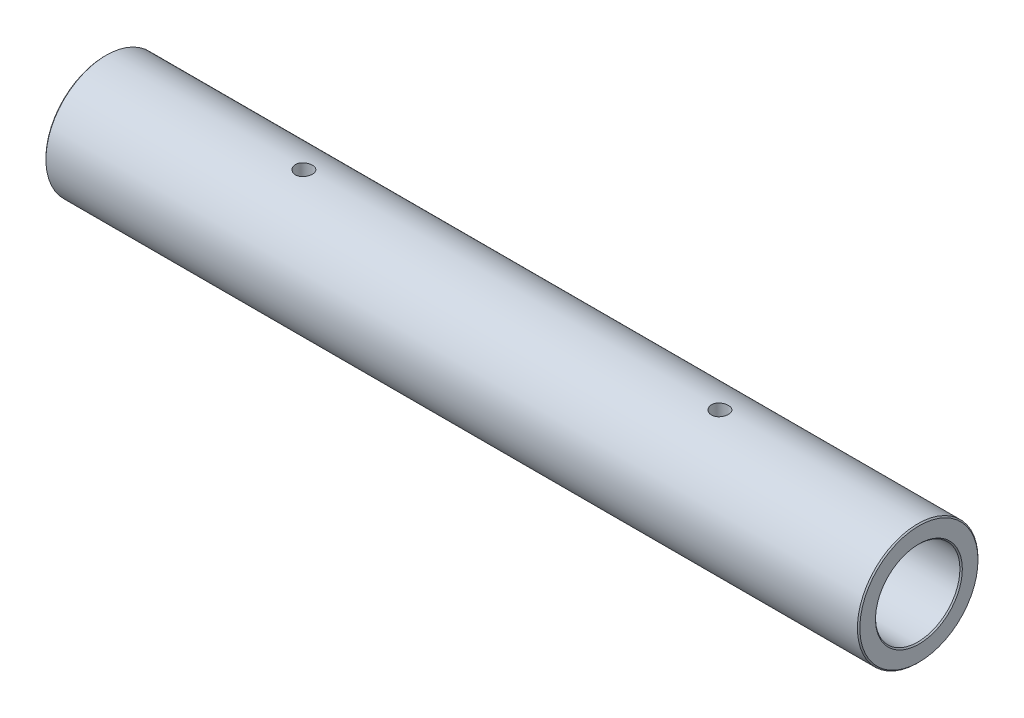
ISO-10303-21;
HEADER;
FILE_DESCRIPTION(('STEP AP214'),'2;1');
FILE_NAME('part.step','',(''),(''),'','','');
FILE_SCHEMA(('AUTOMOTIVE_DESIGN { 1 0 10303 214 1 1 1 1 }'));
ENDSEC;
DATA;
#1=APPLICATION_CONTEXT('core data for automotive mechanical design processes');
#2=APPLICATION_PROTOCOL_DEFINITION('international standard','automotive_design',2000,#1);
#3=PRODUCT_CONTEXT('',#1,'mechanical');
#4=PRODUCT('Part','Part','',(#3));
#5=PRODUCT_RELATED_PRODUCT_CATEGORY('part','',(#4));
#6=PRODUCT_DEFINITION_FORMATION('','',#4);
#7=PRODUCT_DEFINITION_CONTEXT('part definition',#1,'design');
#8=PRODUCT_DEFINITION('design','',#6,#7);
#9=PRODUCT_DEFINITION_SHAPE('','',#8);
#10=(LENGTH_UNIT() NAMED_UNIT(*) SI_UNIT(.MILLI.,.METRE.));
#11=(NAMED_UNIT(*) PLANE_ANGLE_UNIT() SI_UNIT($,.RADIAN.));
#12=(NAMED_UNIT(*) SI_UNIT($,.STERADIAN.) SOLID_ANGLE_UNIT());
#13=UNCERTAINTY_MEASURE_WITH_UNIT(LENGTH_MEASURE(1.E-05),#10,'distance_accuracy_value','');
#14=(GEOMETRIC_REPRESENTATION_CONTEXT(3) GLOBAL_UNCERTAINTY_ASSIGNED_CONTEXT((#13)) GLOBAL_UNIT_ASSIGNED_CONTEXT((#10,
#11,#12)) REPRESENTATION_CONTEXT('',''));
#15=CARTESIAN_POINT('',(0.,0.,0.));
#16=DIRECTION('',(0.,0.,1.));
#17=DIRECTION('',(1.,0.,0.));
#18=AXIS2_PLACEMENT_3D('',#15,#16,#17);
#19=CARTESIAN_POINT('',(337.5,0.,0.));
#20=DIRECTION('',(1.,0.,0.));
#21=DIRECTION('',(0.,0.,-1.));
#22=AXIS2_PLACEMENT_3D('',#19,#20,#21);
#23=PLANE('',#22);
#24=CARTESIAN_POINT('',(337.5,0.,0.));
#25=DIRECTION('',(1.,0.,0.));
#26=DIRECTION('',(0.,0.,-1.));
#27=AXIS2_PLACEMENT_3D('',#24,#25,#26);
#28=CIRCLE('',#27,36.);
#29=CARTESIAN_POINT('',(337.5,0.,-36.));
#30=VERTEX_POINT('',#29);
#31=EDGE_CURVE('E105',#30,#30,#28,.F.);
#32=ORIENTED_EDGE('',*,*,#31,.T.);
#33=EDGE_LOOP('',(#32));
#34=FACE_BOUND('',#33,.T.);
#35=CARTESIAN_POINT('',(337.5,0.,0.));
#36=DIRECTION('',(1.,0.,0.));
#37=DIRECTION('',(0.,0.,-1.));
#38=AXIS2_PLACEMENT_3D('',#35,#36,#37);
#39=CIRCLE('',#38,49.);
#40=CARTESIAN_POINT('',(337.5,0.,-49.));
#41=VERTEX_POINT('',#40);
#42=EDGE_CURVE('E102',#41,#41,#39,.T.);
#43=ORIENTED_EDGE('',*,*,#42,.T.);
#44=EDGE_LOOP('',(#43));
#45=FACE_BOUND('',#44,.T.);
#46=ADVANCED_FACE('F36',(#34,#45),#23,.T.);
#47=CARTESIAN_POINT('',(-337.5,0.,0.));
#48=DIRECTION('',(1.,0.,0.));
#49=DIRECTION('',(0.,0.,-1.));
#50=AXIS2_PLACEMENT_3D('',#47,#48,#49);
#51=PLANE('',#50);
#52=CARTESIAN_POINT('',(-337.5,0.,0.));
#53=DIRECTION('',(1.,0.,0.));
#54=DIRECTION('',(0.,0.,-1.));
#55=AXIS2_PLACEMENT_3D('',#52,#53,#54);
#56=CIRCLE('',#55,36.);
#57=CARTESIAN_POINT('',(-337.5,0.,-36.));
#58=VERTEX_POINT('',#57);
#59=EDGE_CURVE('E93',#58,#58,#56,.T.);
#60=ORIENTED_EDGE('',*,*,#59,.T.);
#61=EDGE_LOOP('',(#60));
#62=FACE_BOUND('',#61,.T.);
#63=CARTESIAN_POINT('',(-337.5,0.,0.));
#64=DIRECTION('',(1.,0.,0.));
#65=DIRECTION('',(0.,0.,-1.));
#66=AXIS2_PLACEMENT_3D('',#63,#64,#65);
#67=CIRCLE('',#66,49.);
#68=CARTESIAN_POINT('',(-337.5,0.,-49.));
#69=VERTEX_POINT('',#68);
#70=EDGE_CURVE('E86',#69,#69,#67,.F.);
#71=ORIENTED_EDGE('',*,*,#70,.T.);
#72=EDGE_LOOP('',(#71));
#73=FACE_BOUND('',#72,.T.);
#74=ADVANCED_FACE('F121',(#62,#73),#51,.F.);
#75=CARTESIAN_POINT('',(337.5,0.,0.));
#76=DIRECTION('',(-1.,0.,0.));
#77=DIRECTION('',(0.,0.,1.));
#78=AXIS2_PLACEMENT_3D('',#75,#76,#77);
#79=CYLINDRICAL_SURFACE('',#78,50.);
#80=CARTESIAN_POINT('',(172.5,49.5075751779463,6.9999999999999));
#81=CARTESIAN_POINT('',(172.304371737469,49.5075742195619,7.0000024873045));
#82=CARTESIAN_POINT('',(172.108778988922,49.508737025339,6.99179638429847));
#83=CARTESIAN_POINT('',(171.718933108619,49.5133527271071,6.9590366040485));
#84=CARTESIAN_POINT('',(171.524680277373,49.5168061209619,6.93447937285052));
#85=CARTESIAN_POINT('',(171.138831810879,49.5259077742322,6.86917319689191));
#86=CARTESIAN_POINT('',(170.947238157667,49.531557588397,6.82841278214886));
#87=CARTESIAN_POINT('',(170.568134589252,49.544890809257,6.73098886065671));
#88=CARTESIAN_POINT('',(170.380626198491,49.5525749614738,6.67431952332227));
#89=CARTESIAN_POINT('',(170.011295073144,49.569745378281,6.54557497238451));
#90=CARTESIAN_POINT('',(169.829466276994,49.5792296394395,6.47351687465093));
#91=CARTESIAN_POINT('',(169.472479302258,49.5997390191347,6.3144530902587));
#92=CARTESIAN_POINT('',(169.297323610335,49.6107647050569,6.22744189677519));
#93=CARTESIAN_POINT('',(168.95505663219,49.6340355235198,6.03916430130893));
#94=CARTESIAN_POINT('',(168.787941133478,49.6462800069456,5.93790547566222));
#95=CARTESIAN_POINT('',(168.462741925355,49.6716534846954,5.72177234796911));
#96=CARTESIAN_POINT('',(168.30466159699,49.6847828061808,5.6068929977969));
#97=CARTESIAN_POINT('',(167.997780379262,49.711633199188,5.36363505416028));
#98=CARTESIAN_POINT('',(167.849039535737,49.725357296937,5.23518103826701));
#99=CARTESIAN_POINT('',(167.562834206154,49.7529426741459,4.96618332460431));
#100=CARTESIAN_POINT('',(167.425373912519,49.7668040024821,4.82563517143876));
#101=CARTESIAN_POINT('',(167.162787103797,49.7942646495377,4.53351056852765));
#102=CARTESIAN_POINT('',(167.037656722344,49.8078640493085,4.38193760197937));
#103=CARTESIAN_POINT('',(166.800512718947,49.8344284846222,4.0687155434611));
#104=CARTESIAN_POINT('',(166.688503951431,49.8473932843644,3.90706275607126));
#105=CARTESIAN_POINT('',(166.478049170318,49.8723663664401,3.57421624645339));
#106=CARTESIAN_POINT('',(166.379656501058,49.8843708130001,3.40298849429233));
#107=CARTESIAN_POINT('',(166.197620256442,49.9070318866304,3.05270258047028));
#108=CARTESIAN_POINT('',(166.113982175213,49.9176880112137,2.87364153278896));
#109=CARTESIAN_POINT('',(165.962145575978,49.9373392731115,2.50906467580451));
#110=CARTESIAN_POINT('',(165.893940799324,49.9463350834571,2.32355151835512));
#111=CARTESIAN_POINT('',(165.773416655188,49.9624200749017,1.94735503929413));
#112=CARTESIAN_POINT('',(165.721103112044,49.9695085568322,1.75666984989186));
#113=CARTESIAN_POINT('',(165.589298626563,49.9874959017564,1.18141548551731));
#114=CARTESIAN_POINT('',(165.533773724169,49.9952732613075,0.790829909064364));
#115=CARTESIAN_POINT('',(165.500162434167,49.9999783697864,0.202702792820214));
#116=CARTESIAN_POINT('',(165.497247279961,50.0003852851747,0.00620226612344725));
#117=CARTESIAN_POINT('',(165.507915257207,49.9988920902676,-0.386365899034928));
#118=CARTESIAN_POINT('',(165.521498714754,49.9969919343731,-0.582433528863631));
#119=CARTESIAN_POINT('',(165.586648599948,49.987920652206,-1.16501287819192));
#120=CARTESIAN_POINT('',(165.662440211998,49.977402428133,-1.54903958808307));
#121=CARTESIAN_POINT('',(165.876685790664,49.9485457975375,-2.29867028112914));
#122=CARTESIAN_POINT('',(166.015141197419,49.930207211288,-2.66427384066858));
#123=CARTESIAN_POINT('',(166.351268776677,49.8876649224475,-3.36833788159661));
#124=CARTESIAN_POINT('',(166.549136464915,49.8634419062426,-3.7067039938191));
#125=CARTESIAN_POINT('',(166.998327461031,49.8118337773492,-4.34558869077604));
#126=CARTESIAN_POINT('',(167.249653839436,49.784448483069,-4.64610509994276));
#127=CARTESIAN_POINT('',(167.801191504894,49.7292976825503,-5.20348029586866));
#128=CARTESIAN_POINT('',(168.101803272696,49.7015309291971,-5.45994287008811));
#129=CARTESIAN_POINT('',(168.742011361531,49.6489766681254,-5.91883739315604));
#130=CARTESIAN_POINT('',(169.081607867759,49.6241891745609,-6.12126908531692));
#131=CARTESIAN_POINT('',(169.790533255401,49.5804007120568,-6.46639732382394));
#132=CARTESIAN_POINT('',(170.159880350419,49.5614033224444,-6.60905694059355));
#133=CARTESIAN_POINT('',(170.917615581675,49.5314119490832,-6.83021245323526));
#134=CARTESIAN_POINT('',(171.306002555,49.5204174771833,-6.90871226267631));
#135=CARTESIAN_POINT('',(172.087278102948,49.507768084263,-6.99878442036775));
#136=CARTESIAN_POINT('',(172.480100897886,49.5060350213334,-7.01091675602928));
#137=CARTESIAN_POINT('',(173.262173791808,49.5118975568632,-6.96939183446463));
#138=CARTESIAN_POINT('',(173.651423986638,49.5194929043171,-6.91573634743302));
#139=CARTESIAN_POINT('',(174.413591311245,49.5430848788442,-6.74463275164095));
#140=CARTESIAN_POINT('',(174.786571552847,49.559045189841,-6.62746032373223));
#141=CARTESIAN_POINT('',(175.507595333341,49.5975390756507,-6.33293307239429));
#142=CARTESIAN_POINT('',(175.855637787541,49.6200729361708,-6.15557563307962));
#143=CARTESIAN_POINT('',(176.519425177706,49.6693602724763,-5.74435936657826));
#144=CARTESIAN_POINT('',(176.834942277846,49.696140564199,-5.51013607324));
#145=CARTESIAN_POINT('',(177.422392671078,49.7508214327788,-4.99232790628714));
#146=CARTESIAN_POINT('',(177.694323824915,49.7787220645395,-4.70874061124797));
#147=CARTESIAN_POINT('',(178.188857894727,49.8327413273868,-4.0978685475647));
#148=CARTESIAN_POINT('',(178.411090908536,49.8588456553686,-3.77028338073847));
#149=CARTESIAN_POINT('',(178.79741857791,49.9061166507554,-3.08189117421194));
#150=CARTESIAN_POINT('',(178.961514652893,49.9272834387066,-2.72108494587734));
#151=CARTESIAN_POINT('',(179.160104080253,49.9535067772371,-2.16378161696019));
#152=CARTESIAN_POINT('',(179.218336403287,49.9613211279261,-1.97554939856374));
#153=CARTESIAN_POINT('',(179.318747443416,49.974921742722,-1.59479525933285));
#154=CARTESIAN_POINT('',(179.360931873186,49.9807087284652,-1.40227489086177));
#155=CARTESIAN_POINT('',(179.428926070599,49.9900879179614,-1.01429662618095));
#156=CARTESIAN_POINT('',(179.454733526034,49.9936798117943,-0.818838319159993));
#157=CARTESIAN_POINT('',(179.489775976679,49.9985666139735,-0.42641455845694));
#158=CARTESIAN_POINT('',(179.499011459667,49.9998615899272,-0.229449149306245));
#159=CARTESIAN_POINT('',(179.50083035134,50.000116263601,0.162875522913363));
#160=CARTESIAN_POINT('',(179.493555274599,49.999095807266,0.358234139660836));
#161=CARTESIAN_POINT('',(179.462700005844,49.9947893130399,0.747631379802344));
#162=CARTESIAN_POINT('',(179.43912008554,49.9915033129026,0.941670025138417));
#163=CARTESIAN_POINT('',(179.375826751913,49.9827571551235,1.32708379134989));
#164=CARTESIAN_POINT('',(179.336110397179,49.9772966010995,1.51845842003681));
#165=CARTESIAN_POINT('',(179.240857774867,49.964356700929,1.89708476664585));
#166=CARTESIAN_POINT('',(179.185327244245,49.9568780869318,2.08433795322583));
#167=CARTESIAN_POINT('',(179.058862357442,49.9401116485149,2.45344143717877));
#168=CARTESIAN_POINT('',(178.987931118503,49.9308241902608,2.63529281947014));
#169=CARTESIAN_POINT('',(178.831201586336,49.9107010550067,2.99230317707844));
#170=CARTESIAN_POINT('',(178.745408668204,49.8998659380039,3.16746454414836));
#171=CARTESIAN_POINT('',(178.559516052981,49.876940848227,3.51002207968327));
#172=CARTESIAN_POINT('',(178.459411002318,49.8648504063536,3.67741531123778));
#173=CARTESIAN_POINT('',(178.245661725032,49.839756947314,4.00316230062226));
#174=CARTESIAN_POINT('',(178.132022334435,49.8267542567864,4.16151925751314));
#175=CARTESIAN_POINT('',(177.890936792993,49.8000776057785,4.46949313032906));
#176=CARTESIAN_POINT('',(177.76338087824,49.7863988555827,4.61902372000379));
#177=CARTESIAN_POINT('',(177.496209799235,49.7588632158248,4.90677278922928));
#178=CARTESIAN_POINT('',(177.356599002442,49.7450063923142,5.04499533061145));
#179=CARTESIAN_POINT('',(177.066158215017,49.7174908294354,5.30931036481435));
#180=CARTESIAN_POINT('',(176.915321514793,49.7038322144567,5.43539549831819));
#181=CARTESIAN_POINT('',(176.603604941788,49.6771121761476,5.67441512258667));
#182=CARTESIAN_POINT('',(176.442728797524,49.6640505341947,5.78735445140593));
#183=CARTESIAN_POINT('',(176.111127896417,49.63882329269,5.99989501971025));
#184=CARTESIAN_POINT('',(175.940355912807,49.6266627517635,6.09942320018332));
#185=CARTESIAN_POINT('',(175.59100386586,49.6036686018938,6.28368381887671));
#186=CARTESIAN_POINT('',(175.412426700558,49.5928345060314,6.36842169130181));
#187=CARTESIAN_POINT('',(175.048800850027,49.5728097782608,6.5224663181599));
#188=CARTESIAN_POINT('',(174.863757164238,49.5636179089018,6.59178470122473));
#189=CARTESIAN_POINT('',(174.488457318187,49.5471371629569,6.71453819783707));
#190=CARTESIAN_POINT('',(174.298202363454,49.5398478502906,6.76797695150374));
#191=CARTESIAN_POINT('',(173.843225188123,49.5250988662188,6.87521378879947));
#192=CARTESIAN_POINT('',(173.576778770444,49.5185568763776,6.92195804145606));
#193=CARTESIAN_POINT('',(173.040198981886,49.5097957164965,6.98434926668703));
#194=CARTESIAN_POINT('',(172.770065649809,49.507576501,6.9999965662653));
#195=CARTESIAN_POINT('',(172.5,49.5075751779463,6.9999999999999));
#196=B_SPLINE_CURVE_WITH_KNOTS('',3,(#80,#81,#82,#83,#84,#85,#86,#87,#88,#89,#90,#91,#92,#93,
#94,#95,#96,#97,#98,#99,#100,#101,#102,#103,#104,#105,#106,#107,#108,#109,#110,#111,#112,#113,
#114,#115,#116,#117,#118,#119,#120,#121,#122,#123,#124,#125,#126,#127,#128,#129,#130,#131,#132,
#133,#134,#135,#136,#137,#138,#139,#140,#141,#142,#143,#144,#145,#146,#147,#148,#149,#150,#151,
#152,#153,#154,#155,#156,#157,#158,#159,#160,#161,#162,#163,#164,#165,#166,#167,#168,#169,#170,
#171,#172,#173,#174,#175,#176,#177,#178,#179,#180,#181,#182,#183,#184,#185,#186,#187,#188,#189,
#190,#191,#192,#193,#194,#195),.UNSPECIFIED.,.T.,.F.,(4,2,2,2,2,2,2,2,2,2,2,2,2,2,2,2,2,2,2,2,2,
2,2,2,2,2,2,2,2,2,2,2,2,2,2,2,2,2,2,2,2,2,2,2,2,2,2,2,2,2,2,2,2,2,2,2,2,4),(0.,0.58664826920883,
1.1734240893636,1.76061602080772,2.34802343839396,2.93478089402252,3.52175490160288,
4.10841795066355,4.69529911624562,5.28563204952744,5.87618339611083,6.46654896667911,
7.05713226174528,7.64996749451643,8.24302301596451,8.83583760368663,9.42886920408008,
10.605879584801,11.1948818896203,11.7838958362122,12.9526150300912,14.1213610848396,
15.2939962415584,16.4666987695873,17.6494512457908,18.832209340864,20.0156971173924,
21.1991126990852,22.3725274188724,23.5459105655402,24.7142412163783,25.8826226541253,
27.0586999355635,28.2348349227233,29.4194522611137,30.6040406749904,31.1950239956348,
31.7857967427278,32.3766528804295,32.9674916265957,33.5532853471525,34.1390693060796,
34.7249600918604,35.3106386024434,35.8961986767371,36.4815474090824,37.0671156715857,
37.6524753258584,38.2428409612757,38.832993598701,39.4235018408601,40.0137920662983,
40.6071781107321,41.2003456742281,41.7930643713427,42.3856470933674,43.1955260445831,
44.0053964793708),.UNSPECIFIED.);
#197=CARTESIAN_POINT('',(172.5,49.5075751779463,6.9999999999999));
#198=VERTEX_POINT('',#197);
#199=EDGE_CURVE('E10',#198,#198,#196,.T.);
#200=ORIENTED_EDGE('',*,*,#199,.T.);
#201=EDGE_LOOP('',(#200));
#202=FACE_BOUND('',#201,.T.);
#203=CARTESIAN_POINT('',(-172.5,49.5075751779463,7.00000000000012));
#204=CARTESIAN_POINT('',(-172.695628262531,49.5075742195619,7.00000248730472));
#205=CARTESIAN_POINT('',(-172.891221011078,49.5087370253389,6.99179638429869));
#206=CARTESIAN_POINT('',(-173.281066891381,49.513352727107,6.95903660404872));
#207=CARTESIAN_POINT('',(-173.475319722627,49.5168061209618,6.93447937285074));
#208=CARTESIAN_POINT('',(-173.861168189121,49.5259077742322,6.86917319689213));
#209=CARTESIAN_POINT('',(-174.052761842333,49.531557588397,6.82841278214908));
#210=CARTESIAN_POINT('',(-174.431865410748,49.544890809257,6.73098886065693));
#211=CARTESIAN_POINT('',(-174.619373801509,49.5525749614737,6.67431952332249));
#212=CARTESIAN_POINT('',(-174.988704926856,49.569745378281,6.54557497238473));
#213=CARTESIAN_POINT('',(-175.170533723006,49.5792296394395,6.47351687465115));
#214=CARTESIAN_POINT('',(-175.527520697742,49.5997390191347,6.3144530902589));
#215=CARTESIAN_POINT('',(-175.702676389665,49.6107647050569,6.22744189677537));
#216=CARTESIAN_POINT('',(-176.04494336781,49.6340355235198,6.03916430130913));
#217=CARTESIAN_POINT('',(-176.212058866522,49.6462800069456,5.93790547566244));
#218=CARTESIAN_POINT('',(-176.537258074645,49.6716534846954,5.72177234796924));
#219=CARTESIAN_POINT('',(-176.69533840301,49.6847828061808,5.60689299779692));
#220=CARTESIAN_POINT('',(-177.002219620738,49.711633199188,5.36363505416027));
#221=CARTESIAN_POINT('',(-177.150960464263,49.725357296937,5.2351810382671));
#222=CARTESIAN_POINT('',(-177.437165793846,49.7529426741459,4.96618332460445));
#223=CARTESIAN_POINT('',(-177.574626087481,49.7668040024821,4.82563517143886));
#224=CARTESIAN_POINT('',(-177.837212896203,49.7942646495377,4.53351056852772));
#225=CARTESIAN_POINT('',(-177.962343277656,49.8078640493085,4.38193760197946));
#226=CARTESIAN_POINT('',(-178.199487281053,49.8344284846222,4.06871554346116));
#227=CARTESIAN_POINT('',(-178.311496048569,49.8473932843643,3.90706275607127));
#228=CARTESIAN_POINT('',(-178.521950829682,49.8723663664401,3.57421624645339));
#229=CARTESIAN_POINT('',(-178.620343498942,49.8843708130001,3.40298849429236));
#230=CARTESIAN_POINT('',(-178.802379743559,49.9070318866304,3.05270258047033));
#231=CARTESIAN_POINT('',(-178.886017824787,49.9176880112137,2.873641532789));
#232=CARTESIAN_POINT('',(-179.037854424022,49.9373392731115,2.50906467580454));
#233=CARTESIAN_POINT('',(-179.106059200676,49.9463350834571,2.32355151835515));
#234=CARTESIAN_POINT('',(-179.226583344812,49.9624200749017,1.94735503929416));
#235=CARTESIAN_POINT('',(-179.278896887956,49.9695085568322,1.75666984989187));
#236=CARTESIAN_POINT('',(-179.410701373437,49.9874959017564,1.18141548551729));
#237=CARTESIAN_POINT('',(-179.466226275831,49.9952732613075,0.790829909064359));
#238=CARTESIAN_POINT('',(-179.499837565833,49.9999783697864,0.202702792820212));
#239=CARTESIAN_POINT('',(-179.502752720039,50.0003852851747,0.00620226612344383));
#240=CARTESIAN_POINT('',(-179.492084742793,49.9988920902676,-0.386365899034933));
#241=CARTESIAN_POINT('',(-179.478501285246,49.9969919343731,-0.582433528863635));
#242=CARTESIAN_POINT('',(-179.413351400052,49.987920652206,-1.16501287819192));
#243=CARTESIAN_POINT('',(-179.337559788002,49.977402428133,-1.54903958808305));
#244=CARTESIAN_POINT('',(-179.123314209336,49.9485457975375,-2.29867028112912));
#245=CARTESIAN_POINT('',(-178.984858802581,49.930207211288,-2.66427384066859));
#246=CARTESIAN_POINT('',(-178.648731223323,49.8876649224475,-3.36833788159659));
#247=CARTESIAN_POINT('',(-178.450863535085,49.8634419062426,-3.70670399381902));
#248=CARTESIAN_POINT('',(-178.001672538969,49.8118337773492,-4.34558869077598));
#249=CARTESIAN_POINT('',(-177.750346160564,49.7844484830689,-4.64610509994278));
#250=CARTESIAN_POINT('',(-177.198808495106,49.7292976825504,-5.20348029586865));
#251=CARTESIAN_POINT('',(-176.898196727304,49.7015309291971,-5.45994287008797));
#252=CARTESIAN_POINT('',(-176.257988638469,49.6489766681254,-5.91883739315591));
#253=CARTESIAN_POINT('',(-175.918392132241,49.6241891745609,-6.12126908531693));
#254=CARTESIAN_POINT('',(-175.209466744599,49.5804007120569,-6.46639732382393));
#255=CARTESIAN_POINT('',(-174.84011964958,49.5614033224444,-6.60905694059339));
#256=CARTESIAN_POINT('',(-174.082384418325,49.5314119490832,-6.83021245323499));
#257=CARTESIAN_POINT('',(-173.693997445,49.5204174771833,-6.90871226267607));
#258=CARTESIAN_POINT('',(-172.912721897052,49.507768084263,-6.99878442036754));
#259=CARTESIAN_POINT('',(-172.519899102114,49.5060350213334,-7.01091675602906));
#260=CARTESIAN_POINT('',(-171.737826208192,49.5118975568632,-6.96939183446441));
#261=CARTESIAN_POINT('',(-171.348576013362,49.5194929043171,-6.91573634743281));
#262=CARTESIAN_POINT('',(-170.586408688755,49.5430848788442,-6.74463275164072));
#263=CARTESIAN_POINT('',(-170.213428447153,49.5590451898411,-6.62746032373197));
#264=CARTESIAN_POINT('',(-169.492404666659,49.5975390756508,-6.33293307239414));
#265=CARTESIAN_POINT('',(-169.144362212459,49.6200729361708,-6.15557563307961));
#266=CARTESIAN_POINT('',(-168.480574822294,49.6693602724763,-5.74435936657826));
#267=CARTESIAN_POINT('',(-168.165057722154,49.6961405641991,-5.51013607323988));
#268=CARTESIAN_POINT('',(-167.577607328922,49.7508214327788,-4.99232790628701));
#269=CARTESIAN_POINT('',(-167.305676175085,49.7787220645395,-4.70874061124795));
#270=CARTESIAN_POINT('',(-166.811142105273,49.8327413273869,-4.09786854756472));
#271=CARTESIAN_POINT('',(-166.588909091464,49.8588456553686,-3.77028338073842));
#272=CARTESIAN_POINT('',(-166.20258142209,49.9061166507554,-3.08189117421187));
#273=CARTESIAN_POINT('',(-166.038485347107,49.9272834387066,-2.72108494587733));
#274=CARTESIAN_POINT('',(-165.839895919747,49.9535067772371,-2.16378161696019));
#275=CARTESIAN_POINT('',(-165.781663596713,49.9613211279261,-1.97554939856373));
#276=CARTESIAN_POINT('',(-165.681252556584,49.974921742722,-1.59479525933283));
#277=CARTESIAN_POINT('',(-165.639068126814,49.9807087284652,-1.40227489086176));
#278=CARTESIAN_POINT('',(-165.5710739294,49.9900879179614,-1.01429662618094));
#279=CARTESIAN_POINT('',(-165.545266473966,49.9936798117943,-0.81883831915999));
#280=CARTESIAN_POINT('',(-165.510224023321,49.9985666139735,-0.426414558456939));
#281=CARTESIAN_POINT('',(-165.500988540333,49.9998615899272,-0.229449149306244));
#282=CARTESIAN_POINT('',(-165.49916964866,50.000116263601,0.162875522913361));
#283=CARTESIAN_POINT('',(-165.506444725401,49.999095807266,0.358234139660832));
#284=CARTESIAN_POINT('',(-165.537299994156,49.9947893130399,0.747631379802341));
#285=CARTESIAN_POINT('',(-165.56087991446,49.9915033129026,0.941670025138416));
#286=CARTESIAN_POINT('',(-165.624173248087,49.9827571551235,1.32708379134989));
#287=CARTESIAN_POINT('',(-165.663889602821,49.9772966010995,1.51845842003682));
#288=CARTESIAN_POINT('',(-165.759142225133,49.964356700929,1.89708476664585));
#289=CARTESIAN_POINT('',(-165.814672755755,49.9568780869318,2.08433795322582));
#290=CARTESIAN_POINT('',(-165.941137642558,49.9401116485149,2.45344143717878));
#291=CARTESIAN_POINT('',(-166.012068881496,49.9308241902608,2.63529281947016));
#292=CARTESIAN_POINT('',(-166.168798413664,49.9107010550067,2.99230317707849));
#293=CARTESIAN_POINT('',(-166.254591331795,49.8998659380039,3.1674645441484));
#294=CARTESIAN_POINT('',(-166.440483947019,49.876940848227,3.51002207968333));
#295=CARTESIAN_POINT('',(-166.540588997682,49.8648504063536,3.67741531123785));
#296=CARTESIAN_POINT('',(-166.754338274968,49.839756947314,4.00316230062229));
#297=CARTESIAN_POINT('',(-166.867977665565,49.8267542567864,4.16151925751312));
#298=CARTESIAN_POINT('',(-167.109063207007,49.8000776057785,4.46949313032907));
#299=CARTESIAN_POINT('',(-167.23661912176,49.7863988555827,4.61902372000388));
#300=CARTESIAN_POINT('',(-167.503790200765,49.7588632158248,4.90677278922941));
#301=CARTESIAN_POINT('',(-167.643400997558,49.7450063923142,5.04499533061155));
#302=CARTESIAN_POINT('',(-167.933841784983,49.7174908294354,5.30931036481447));
#303=CARTESIAN_POINT('',(-168.084678485207,49.7038322144567,5.43539549831835));
#304=CARTESIAN_POINT('',(-168.396395058212,49.6771121761476,5.67441512258676));
#305=CARTESIAN_POINT('',(-168.557271202476,49.6640505341947,5.78735445140592));
#306=CARTESIAN_POINT('',(-168.888872103583,49.63882329269,5.99989501971027));
#307=CARTESIAN_POINT('',(-169.059644087193,49.6266627517635,6.09942320018346));
#308=CARTESIAN_POINT('',(-169.40899613414,49.6036686018938,6.28368381887696));
#309=CARTESIAN_POINT('',(-169.587573299442,49.5928345060313,6.36842169130202));
#310=CARTESIAN_POINT('',(-169.951199149973,49.5728097782608,6.5224663181601));
#311=CARTESIAN_POINT('',(-170.136242835762,49.5636179089018,6.59178470122494));
#312=CARTESIAN_POINT('',(-170.511542681813,49.5471371629568,6.71453819783729));
#313=CARTESIAN_POINT('',(-170.701797636546,49.5398478502906,6.76797695150396));
#314=CARTESIAN_POINT('',(-171.156774811877,49.5250988662188,6.87521378879969));
#315=CARTESIAN_POINT('',(-171.423221229556,49.5185568763776,6.92195804145628));
#316=CARTESIAN_POINT('',(-171.959801018113,49.5097957164965,6.98434926668725));
#317=CARTESIAN_POINT('',(-172.229934350191,49.507576501,6.99999656626552));
#318=CARTESIAN_POINT('',(-172.5,49.5075751779463,7.00000000000012));
#319=B_SPLINE_CURVE_WITH_KNOTS('',3,(#203,#204,#205,#206,#207,#208,#209,#210,#211,#212,#213,
#214,#215,#216,#217,#218,#219,#220,#221,#222,#223,#224,#225,#226,#227,#228,#229,#230,#231,#232,
#233,#234,#235,#236,#237,#238,#239,#240,#241,#242,#243,#244,#245,#246,#247,#248,#249,#250,#251,
#252,#253,#254,#255,#256,#257,#258,#259,#260,#261,#262,#263,#264,#265,#266,#267,#268,#269,#270,
#271,#272,#273,#274,#275,#276,#277,#278,#279,#280,#281,#282,#283,#284,#285,#286,#287,#288,#289,
#290,#291,#292,#293,#294,#295,#296,#297,#298,#299,#300,#301,#302,#303,#304,#305,#306,#307,#308,
#309,#310,#311,#312,#313,#314,#315,#316,#317,#318),.UNSPECIFIED.,.T.,.F.,(4,2,2,2,2,2,2,2,2,2,2,
2,2,2,2,2,2,2,2,2,2,2,2,2,2,2,2,2,2,2,2,2,2,2,2,2,2,2,2,2,2,2,2,2,2,2,2,2,2,2,2,2,2,2,2,2,2,4),
(0.,0.586648269208857,1.17342408936363,1.76061602080772,2.34802343839396,2.93478089402258,
3.52175490160292,4.10841795066362,4.69529911624576,5.2856320495276,5.87618339611098,
6.46654896667929,7.05713226174545,7.6499674945166,8.24302301596467,8.83583760368681,
9.42886920408027,10.6058795848012,11.1948818896205,11.7838958362124,12.9526150300914,
14.1213610848398,15.2939962415586,16.4666987695874,17.649451245791,18.8322093408641,
20.0156971173925,21.1991126990852,22.3725274188725,23.5459105655402,24.7142412163783,
25.8826226541253,27.0586999355634,28.2348349227232,29.4194522611137,30.6040406749903,
31.1950239956347,31.7857967427277,32.3766528804294,32.9674916265956,33.5532853471524,
34.1390693060795,34.7249600918603,35.3106386024433,35.896198676737,36.4815474090823,
37.0671156715856,37.6524753258583,38.2428409612757,38.832993598701,39.4235018408601,
40.0137920662983,40.6071781107322,41.2003456742282,41.7930643713428,42.3856470933675,
43.1955260445832,44.0053964793708),.UNSPECIFIED.);
#320=CARTESIAN_POINT('',(-172.5,49.5075751779463,7.00000000000012));
#321=VERTEX_POINT('',#320);
#322=EDGE_CURVE('E48',#321,#321,#319,.T.);
#323=ORIENTED_EDGE('',*,*,#322,.T.);
#324=EDGE_LOOP('',(#323));
#325=FACE_BOUND('',#324,.T.);
#326=CARTESIAN_POINT('',(336.5,0.,0.));
#327=DIRECTION('',(1.,0.,0.));
#328=DIRECTION('',(0.,0.,-1.));
#329=AXIS2_PLACEMENT_3D('',#326,#327,#328);
#330=CIRCLE('',#329,50.);
#331=CARTESIAN_POINT('',(336.5,0.,-50.));
#332=VERTEX_POINT('',#331);
#333=EDGE_CURVE('E52',#332,#332,#330,.F.);
#334=ORIENTED_EDGE('',*,*,#333,.T.);
#335=EDGE_LOOP('',(#334));
#336=FACE_BOUND('',#335,.T.);
#337=CARTESIAN_POINT('',(-336.5,0.,0.));
#338=DIRECTION('',(1.,0.,0.));
#339=DIRECTION('',(0.,0.,-1.));
#340=AXIS2_PLACEMENT_3D('',#337,#338,#339);
#341=CIRCLE('',#340,50.);
#342=CARTESIAN_POINT('',(-336.5,0.,-50.));
#343=VERTEX_POINT('',#342);
#344=EDGE_CURVE('E56',#343,#343,#341,.T.);
#345=ORIENTED_EDGE('',*,*,#344,.T.);
#346=EDGE_LOOP('',(#345));
#347=FACE_BOUND('',#346,.T.);
#348=ADVANCED_FACE('F63',(#202,#325,#336,#347),#79,.T.);
#349=CARTESIAN_POINT('',(337.5,0.,0.));
#350=DIRECTION('',(-1.,0.,0.));
#351=DIRECTION('',(0.,0.,1.));
#352=AXIS2_PLACEMENT_3D('',#349,#350,#351);
#353=CYLINDRICAL_SURFACE('',#352,35.);
#354=CARTESIAN_POINT('',(172.5,34.2928563989645,6.9999999999999));
#355=CARTESIAN_POINT('',(172.30545934632,34.2928542797225,7.00000389095709));
#356=CARTESIAN_POINT('',(172.110967268575,34.2945148954922,6.99188801366512));
#357=CARTESIAN_POINT('',(171.723330884614,34.3011034836287,6.95949683507338));
#358=CARTESIAN_POINT('',(171.53018681184,34.3060320083951,6.93521880175941));
#359=CARTESIAN_POINT('',(171.146600215405,34.3190167601714,6.87067419735102));
#360=CARTESIAN_POINT('',(170.956159153806,34.3270746176636,6.83039929112586));
#361=CARTESIAN_POINT('',(170.579355501273,34.3460835935797,6.73416267372297));
#362=CARTESIAN_POINT('',(170.392994438892,34.3570357769216,6.67819518826368));
#363=CARTESIAN_POINT('',(170.025981403369,34.3814962286959,6.55109873595609));
#364=CARTESIAN_POINT('',(169.845321903574,34.3950009473718,6.47999080743016));
#365=CARTESIAN_POINT('',(169.490611742124,34.4241943956611,6.32306946499858));
#366=CARTESIAN_POINT('',(169.31656354744,34.4398839305321,6.23725062638704));
#367=CARTESIAN_POINT('',(168.976391325697,34.4729918936136,6.05158762924747));
#368=CARTESIAN_POINT('',(168.810263819854,34.4904095522769,5.95174970537722));
#369=CARTESIAN_POINT('',(168.486889074123,34.5265003577859,5.73867999019375));
#370=CARTESIAN_POINT('',(168.329645182598,34.5451739722872,5.62544319775775));
#371=CARTESIAN_POINT('',(168.023258326684,34.5834906621567,5.38490320718992));
#372=CARTESIAN_POINT('',(167.874239066271,34.6031428483898,5.25744386656274));
#373=CARTESIAN_POINT('',(167.587375326751,34.6426570241118,4.99044372153226));
#374=CARTESIAN_POINT('',(167.449535009771,34.6625190886595,4.85089845694037));
#375=CARTESIAN_POINT('',(167.18606254955,34.7018870431761,4.56075187927795));
#376=CARTESIAN_POINT('',(167.060426809435,34.7213930366998,4.41015384673625));
#377=CARTESIAN_POINT('',(166.822138009048,34.7595206375688,4.09881994508925));
#378=CARTESIAN_POINT('',(166.709489750047,34.7781419163626,3.93808036056915));
#379=CARTESIAN_POINT('',(166.497117341562,34.8141285985003,3.60618146589423));
#380=CARTESIAN_POINT('',(166.397512035267,34.8314818914843,3.43494476219598));
#381=CARTESIAN_POINT('',(166.213103303971,34.8642629734238,3.08449905822691));
#382=CARTESIAN_POINT('',(166.128299952565,34.8796907528057,2.90529001832379));
#383=CARTESIAN_POINT('',(165.974146831296,34.908179819373,2.54017791728321));
#384=CARTESIAN_POINT('',(165.904795784071,34.9212413021513,2.35427541093719));
#385=CARTESIAN_POINT('',(165.782081463785,34.9446247370939,1.97709418612425));
#386=CARTESIAN_POINT('',(165.728718329049,34.9549466655558,1.78581542115846));
#387=CARTESIAN_POINT('',(165.639014897742,34.9724349319714,1.40186550676888));
#388=CARTESIAN_POINT('',(165.602456693707,34.9796415875702,1.20924710383651));
#389=CARTESIAN_POINT('',(165.545604830626,34.99089649479,0.821467173204423));
#390=CARTESIAN_POINT('',(165.525316784698,34.9949436563895,0.626304791423064));
#391=CARTESIAN_POINT('',(165.501202790475,34.9997572515947,0.234999361351052));
#392=CARTESIAN_POINT('',(165.497369468038,35.0005251547908,0.0388567917932862));
#393=CARTESIAN_POINT('',(165.506156916599,34.9987696538411,-0.353064342322963));
#394=CARTESIAN_POINT('',(165.518783730468,34.9962450409412,-0.548842746759024));
#395=CARTESIAN_POINT('',(165.580683565215,34.9839237383026,-1.1277607355728));
#396=CARTESIAN_POINT('',(165.653614921571,34.9694500892654,-1.50855798123315));
#397=CARTESIAN_POINT('',(165.860955145813,34.9294541975738,-2.25218390741994));
#398=CARTESIAN_POINT('',(165.995366473468,34.9039315128575,-2.61501186836403));
#399=CARTESIAN_POINT('',(166.322710303044,34.84441023558,-3.31531933438614));
#400=CARTESIAN_POINT('',(166.516006263634,34.8103592420023,-3.6526246856025));
#401=CARTESIAN_POINT('',(166.955363534756,34.7375329934434,-4.29033985487514));
#402=CARTESIAN_POINT('',(167.201430916809,34.6987571950801,-4.59074542123281));
#403=CARTESIAN_POINT('',(167.744435356372,34.6199674696839,-5.15165877147283));
#404=CARTESIAN_POINT('',(168.042184307504,34.5799437423234,-5.41137988226052));
#405=CARTESIAN_POINT('',(168.677415096758,34.5038100216161,-5.87732978599922));
#406=CARTESIAN_POINT('',(169.014897686206,34.4677001023005,-6.08355756720394));
#407=CARTESIAN_POINT('',(169.721145822735,34.4034633201157,-6.43693961431569));
#408=CARTESIAN_POINT('',(170.089976772996,34.3753537072251,-6.58396651205681));
#409=CARTESIAN_POINT('',(170.847799266408,34.3305533420015,-6.81373241371738));
#410=CARTESIAN_POINT('',(171.236788174958,34.3138611014723,-6.89647979633344));
#411=CARTESIAN_POINT('',(172.0167540044,34.2940835482737,-6.99416204211836));
#412=CARTESIAN_POINT('',(172.407583014176,34.2907702916494,-7.01023303331902));
#413=CARTESIAN_POINT('',(173.186337568425,34.2975139969792,-6.97716337714122));
#414=CARTESIAN_POINT('',(173.574263276285,34.3075702007743,-6.92802642759274));
#415=CARTESIAN_POINT('',(174.332380459799,34.3397062729133,-6.76691553997755));
#416=CARTESIAN_POINT('',(174.702706318621,34.3616699229085,-6.6555486574733));
#417=CARTESIAN_POINT('',(175.419443035838,34.4150442627234,-6.37378693553607));
#418=CARTESIAN_POINT('',(175.765851921359,34.4464557307366,-6.20338723353822));
#419=CARTESIAN_POINT('',(176.429891457324,34.5156983862449,-5.80583017374295));
#420=CARTESIAN_POINT('',(176.747088151459,34.5536079136606,-5.57796196972934));
#421=CARTESIAN_POINT('',(177.339159356774,34.6313607847593,-5.07286458118357));
#422=CARTESIAN_POINT('',(177.614029506664,34.6712043271659,-4.79563031635503));
#423=CARTESIAN_POINT('',(178.117933468159,34.7490737676458,-4.19464268773554));
#424=CARTESIAN_POINT('',(178.346198870533,34.7870623737146,-3.87024053929894));
#425=CARTESIAN_POINT('',(178.745037881812,34.8563005998267,-3.18681223229982));
#426=CARTESIAN_POINT('',(178.915613913502,34.8875505028559,-2.82778752859806));
#427=CARTESIAN_POINT('',(179.123809708246,34.9266427836783,-2.27247483889986));
#428=CARTESIAN_POINT('',(179.185174905534,34.9383579826346,-2.0850345476357));
#429=CARTESIAN_POINT('',(179.291906270396,34.9589360783695,-1.70551726287589));
#430=CARTESIAN_POINT('',(179.337278296827,34.9678000195592,-1.51344199494295));
#431=CARTESIAN_POINT('',(179.411656485798,34.9824194773933,-1.12602619914345));
#432=CARTESIAN_POINT('',(179.440661124837,34.988174704672,-0.93068536905559));
#433=CARTESIAN_POINT('',(179.482069178403,34.9964123063053,-0.538185252845684));
#434=CARTESIAN_POINT('',(179.494473196975,34.9988947997447,-0.34102603315216));
#435=CARTESIAN_POINT('',(179.502506400762,35.0005011817442,0.0502102574621726));
#436=CARTESIAN_POINT('',(179.498423779934,34.9996827719041,0.244281250281566));
#437=CARTESIAN_POINT('',(179.474164825142,34.9948401018662,0.631371462473539));
#438=CARTESIAN_POINT('',(179.453988795626,34.9908159023141,0.824390701673158));
#439=CARTESIAN_POINT('',(179.397699127342,34.9796725790586,1.20803191336486));
#440=CARTESIAN_POINT('',(179.361582839513,34.9725529409369,1.39865348197777));
#441=CARTESIAN_POINT('',(179.273711489928,34.9554189404847,1.77605100097132));
#442=CARTESIAN_POINT('',(179.221962018854,34.94540561304,1.96282830066187));
#443=CARTESIAN_POINT('',(179.103332552159,34.922780819553,2.33094914275901));
#444=CARTESIAN_POINT('',(179.036482080825,34.9101744275103,2.51230251642126));
#445=CARTESIAN_POINT('',(178.88811892672,34.8826999308493,2.86865360679035));
#446=CARTESIAN_POINT('',(178.806611440411,34.8678326280961,3.04365354968324));
#447=CARTESIAN_POINT('',(178.62947073124,34.836228514894,3.3862655965251));
#448=CARTESIAN_POINT('',(178.533831700964,34.8194909365402,3.55387462620366));
#449=CARTESIAN_POINT('',(178.329159851612,34.7846078549353,3.88046673178617));
#450=CARTESIAN_POINT('',(178.220131638396,34.7664628366282,4.0394527470136));
#451=CARTESIAN_POINT('',(177.987492125139,34.7289386446036,4.35037321353206));
#452=CARTESIAN_POINT('',(177.863669843843,34.7095440448016,4.50214798164817));
#453=CARTESIAN_POINT('',(177.603824036427,34.6703408508202,4.79471019036676));
#454=CARTESIAN_POINT('',(177.467804811733,34.6505324044654,4.93550147195225));
#455=CARTESIAN_POINT('',(177.184361537027,34.6110320828186,5.20529163257664));
#456=CARTESIAN_POINT('',(177.03693071447,34.5913402843335,5.33428340824145));
#457=CARTESIAN_POINT('',(176.731781453002,34.5526421947793,5.57945504055579));
#458=CARTESIAN_POINT('',(176.574066811927,34.5336356546248,5.69563958477054));
#459=CARTESIAN_POINT('',(176.247540683462,34.4966297420908,5.91566787495986));
#460=CARTESIAN_POINT('',(176.078624879735,34.4786439992267,6.01935919427372));
#461=CARTESIAN_POINT('',(175.732537534436,34.4444430865323,6.21207843877614));
#462=CARTESIAN_POINT('',(175.555369065083,34.4282272652115,6.30111176560157));
#463=CARTESIAN_POINT('',(175.194060438292,34.3980463487102,6.46384261785573));
#464=CARTESIAN_POINT('',(175.009924611212,34.3840798829881,6.5375494897882));
#465=CARTESIAN_POINT('',(174.635960402669,34.3588051857851,6.66910612133483));
#466=CARTESIAN_POINT('',(174.446133130461,34.3474964400669,6.72695894887978));
#467=CARTESIAN_POINT('',(173.968295236148,34.3230918011448,6.8506328392077));
#468=CARTESIAN_POINT('',(173.677570867454,34.3118161996909,6.90656871564763));
#469=CARTESIAN_POINT('',(173.091193516463,34.2967002365109,6.98124869944005));
#470=CARTESIAN_POINT('',(172.795540704433,34.2928596184575,6.99999408896687));
#471=CARTESIAN_POINT('',(172.5,34.2928563989645,6.9999999999999));
#472=B_SPLINE_CURVE_WITH_KNOTS('',3,(#354,#355,#356,#357,#358,#359,#360,#361,#362,#363,#364,
#365,#366,#367,#368,#369,#370,#371,#372,#373,#374,#375,#376,#377,#378,#379,#380,#381,#382,#383,
#384,#385,#386,#387,#388,#389,#390,#391,#392,#393,#394,#395,#396,#397,#398,#399,#400,#401,#402,
#403,#404,#405,#406,#407,#408,#409,#410,#411,#412,#413,#414,#415,#416,#417,#418,#419,#420,#421,
#422,#423,#424,#425,#426,#427,#428,#429,#430,#431,#432,#433,#434,#435,#436,#437,#438,#439,#440,
#441,#442,#443,#444,#445,#446,#447,#448,#449,#450,#451,#452,#453,#454,#455,#456,#457,#458,#459,
#460,#461,#462,#463,#464,#465,#466,#467,#468,#469,#470,#471),.UNSPECIFIED.,.T.,.F.,(4,2,2,2,2,2,
2,2,2,2,2,2,2,2,2,2,2,2,2,2,2,2,2,2,2,2,2,2,2,2,2,2,2,2,2,2,2,2,2,2,2,2,2,2,2,2,2,2,2,2,2,2,2,2,
2,2,2,2,4),(0.,0.58336216820802,1.16682297168169,1.75058818560314,2.33456848579735,
2.91774255407556,3.50113213452132,4.08426308310907,4.66761237578463,5.25815017323005,
5.84890683895647,6.43948886812871,7.03028853102466,7.62614379491017,8.222002021259,
8.81781097277179,9.41362507898017,10.0014788371089,10.5895353145451,11.1773282284752,
11.7653369946999,12.9233314209101,14.0813721817249,15.2467108421237,16.4121836504671,
17.5979704199364,18.7837796151529,19.9721265686742,21.1603185977213,22.3281791929515,
23.4959735636495,24.6525700714923,25.8092618714679,26.9810303308765,28.1529194475747,
29.3427982680017,30.5326271107675,31.1247657596901,31.7166872615582,32.3086638512363,
32.9006189001033,33.4822714935317,34.0639130837874,34.6456513716522,35.2271818662342,
35.8075850904261,36.3877829441503,36.968219899134,37.5484577410291,38.1382717920521,
38.7278786486824,39.3178381478799,39.9075809944064,40.5039145742209,41.1000279040434,
41.695776634083,42.2914099986973,43.1776679970547,44.063895440367),.UNSPECIFIED.);
#473=CARTESIAN_POINT('',(172.5,34.2928563989645,6.9999999999999));
#474=VERTEX_POINT('',#473);
#475=EDGE_CURVE('E87',#474,#474,#472,.T.);
#476=ORIENTED_EDGE('',*,*,#475,.F.);
#477=EDGE_LOOP('',(#476));
#478=FACE_BOUND('',#477,.T.);
#479=CARTESIAN_POINT('',(-172.5,34.2928563989645,7.00000000000012));
#480=CARTESIAN_POINT('',(-172.69454065368,34.2928542797225,7.00000389095731));
#481=CARTESIAN_POINT('',(-172.889032731425,34.2945148954921,6.99188801366534));
#482=CARTESIAN_POINT('',(-173.276669115386,34.3011034836287,6.9594968350736));
#483=CARTESIAN_POINT('',(-173.46981318816,34.306032008395,6.93521880175963));
#484=CARTESIAN_POINT('',(-173.853399784595,34.3190167601714,6.87067419735125));
#485=CARTESIAN_POINT('',(-174.043840846194,34.3270746176636,6.83039929112608));
#486=CARTESIAN_POINT('',(-174.420644498726,34.3460835935797,6.73416267372319));
#487=CARTESIAN_POINT('',(-174.607005561108,34.3570357769216,6.6781951882639));
#488=CARTESIAN_POINT('',(-174.974018596631,34.3814962286959,6.55109873595631));
#489=CARTESIAN_POINT('',(-175.154678096426,34.3950009473718,6.47999080743037));
#490=CARTESIAN_POINT('',(-175.509388257876,34.424194395661,6.32306946499878));
#491=CARTESIAN_POINT('',(-175.68343645256,34.4398839305321,6.23725062638723));
#492=CARTESIAN_POINT('',(-176.023608674303,34.4729918936136,6.05158762924767));
#493=CARTESIAN_POINT('',(-176.189736180146,34.4904095522768,5.95174970537744));
#494=CARTESIAN_POINT('',(-176.513110925877,34.5265003577859,5.73867999019389));
#495=CARTESIAN_POINT('',(-176.670354817401,34.5451739722872,5.62544319775777));
#496=CARTESIAN_POINT('',(-176.976741673315,34.5834906621567,5.38490320718991));
#497=CARTESIAN_POINT('',(-177.125760933729,34.6031428483898,5.25744386656284));
#498=CARTESIAN_POINT('',(-177.41262467325,34.6426570241117,4.99044372153241));
#499=CARTESIAN_POINT('',(-177.550464990229,34.6625190886595,4.85089845694047));
#500=CARTESIAN_POINT('',(-177.81393745045,34.7018870431761,4.56075187927804));
#501=CARTESIAN_POINT('',(-177.939573190565,34.7213930366998,4.41015384673636));
#502=CARTESIAN_POINT('',(-178.177861990952,34.7595206375688,4.09881994508933));
#503=CARTESIAN_POINT('',(-178.290510249953,34.7781419163626,3.93808036056917));
#504=CARTESIAN_POINT('',(-178.502882658438,34.8141285985003,3.60618146589421));
#505=CARTESIAN_POINT('',(-178.602487964734,34.8314818914843,3.434944762196));
#506=CARTESIAN_POINT('',(-178.786896696029,34.8642629734238,3.08449905822695));
#507=CARTESIAN_POINT('',(-178.871700047435,34.8796907528057,2.90529001832382));
#508=CARTESIAN_POINT('',(-179.025853168704,34.908179819373,2.54017791728324));
#509=CARTESIAN_POINT('',(-179.095204215929,34.9212413021513,2.35427541093722));
#510=CARTESIAN_POINT('',(-179.217918536215,34.9446247370939,1.97709418612427));
#511=CARTESIAN_POINT('',(-179.271281670951,34.9549466655558,1.78581542115846));
#512=CARTESIAN_POINT('',(-179.360985102258,34.9724349319714,1.40186550676888));
#513=CARTESIAN_POINT('',(-179.397543306293,34.9796415875702,1.20924710383651));
#514=CARTESIAN_POINT('',(-179.454395169374,34.99089649479,0.821467173204428));
#515=CARTESIAN_POINT('',(-179.474683215302,34.9949436563895,0.626304791423065));
#516=CARTESIAN_POINT('',(-179.498797209525,34.9997572515947,0.23499936135105));
#517=CARTESIAN_POINT('',(-179.502630531962,35.0005251547908,0.0388567917932837));
#518=CARTESIAN_POINT('',(-179.493843083401,34.9987696538411,-0.353064342322965));
#519=CARTESIAN_POINT('',(-179.481216269532,34.9962450409412,-0.548842746759026));
#520=CARTESIAN_POINT('',(-179.419316434785,34.9839237383026,-1.1277607355728));
#521=CARTESIAN_POINT('',(-179.346385078429,34.9694500892654,-1.50855798123313));
#522=CARTESIAN_POINT('',(-179.139044854187,34.9294541975738,-2.25218390741993));
#523=CARTESIAN_POINT('',(-179.004633526532,34.9039315128575,-2.61501186836405));
#524=CARTESIAN_POINT('',(-178.677289696956,34.84441023558,-3.31531933438613));
#525=CARTESIAN_POINT('',(-178.483993736366,34.8103592420023,-3.65262468560243));
#526=CARTESIAN_POINT('',(-178.044636465244,34.7375329934434,-4.29033985487509));
#527=CARTESIAN_POINT('',(-177.798569083191,34.6987571950801,-4.59074542123284));
#528=CARTESIAN_POINT('',(-177.255564643628,34.6199674696839,-5.15165877147281));
#529=CARTESIAN_POINT('',(-176.957815692496,34.5799437423235,-5.41137988226037));
#530=CARTESIAN_POINT('',(-176.322584903242,34.5038100216161,-5.87732978599908));
#531=CARTESIAN_POINT('',(-175.985102313794,34.4677001023005,-6.08355756720394));
#532=CARTESIAN_POINT('',(-175.278854177265,34.4034633201157,-6.43693961431569));
#533=CARTESIAN_POINT('',(-174.910023227004,34.3753537072252,-6.58396651205666));
#534=CARTESIAN_POINT('',(-174.152200733592,34.3305533420015,-6.81373241371712));
#535=CARTESIAN_POINT('',(-173.763211825042,34.3138611014723,-6.89647979633321));
#536=CARTESIAN_POINT('',(-172.9832459956,34.2940835482737,-6.99416204211816));
#537=CARTESIAN_POINT('',(-172.592416985824,34.2907702916495,-7.0102330333188));
#538=CARTESIAN_POINT('',(-171.813662431575,34.2975139969792,-6.977163377141));
#539=CARTESIAN_POINT('',(-171.425736723715,34.3075702007743,-6.92802642759253));
#540=CARTESIAN_POINT('',(-170.667619540201,34.3397062729133,-6.76691553997732));
#541=CARTESIAN_POINT('',(-170.297293681379,34.3616699229086,-6.65554865747304));
#542=CARTESIAN_POINT('',(-169.580556964162,34.4150442627234,-6.37378693553592));
#543=CARTESIAN_POINT('',(-169.234148078641,34.4464557307367,-6.20338723353821));
#544=CARTESIAN_POINT('',(-168.570108542676,34.5156983862449,-5.80583017374296));
#545=CARTESIAN_POINT('',(-168.252911848541,34.5536079136606,-5.57796196972922));
#546=CARTESIAN_POINT('',(-167.660840643226,34.6313607847593,-5.07286458118344));
#547=CARTESIAN_POINT('',(-167.385970493336,34.6712043271659,-4.79563031635501));
#548=CARTESIAN_POINT('',(-166.882066531841,34.7490737676458,-4.19464268773556));
#549=CARTESIAN_POINT('',(-166.653801129467,34.7870623737146,-3.87024053929889));
#550=CARTESIAN_POINT('',(-166.254962118188,34.8563005998267,-3.18681223229975));
#551=CARTESIAN_POINT('',(-166.084386086498,34.8875505028559,-2.82778752859806));
#552=CARTESIAN_POINT('',(-165.876190291754,34.9266427836783,-2.27247483889986));
#553=CARTESIAN_POINT('',(-165.814825094466,34.9383579826346,-2.08503454763568));
#554=CARTESIAN_POINT('',(-165.708093729604,34.9589360783695,-1.70551726287587));
#555=CARTESIAN_POINT('',(-165.662721703173,34.9678000195592,-1.51344199494293));
#556=CARTESIAN_POINT('',(-165.588343514202,34.9824194773933,-1.12602619914344));
#557=CARTESIAN_POINT('',(-165.559338875163,34.988174704672,-0.930685369055579));
#558=CARTESIAN_POINT('',(-165.517930821597,34.9964123063053,-0.538185252845674));
#559=CARTESIAN_POINT('',(-165.505526803025,34.9988947997447,-0.341026033152156));
#560=CARTESIAN_POINT('',(-165.497493599238,35.0005011817442,0.0502102574621719));
#561=CARTESIAN_POINT('',(-165.501576220066,34.9996827719041,0.244281250281566));
#562=CARTESIAN_POINT('',(-165.525835174858,34.9948401018662,0.631371462473539));
#563=CARTESIAN_POINT('',(-165.546011204374,34.9908159023141,0.824390701673158));
#564=CARTESIAN_POINT('',(-165.602300872658,34.9796725790586,1.20803191336486));
#565=CARTESIAN_POINT('',(-165.638417160487,34.9725529409369,1.39865348197778));
#566=CARTESIAN_POINT('',(-165.726288510072,34.9554189404847,1.77605100097133));
#567=CARTESIAN_POINT('',(-165.778037981146,34.94540561304,1.96282830066187));
#568=CARTESIAN_POINT('',(-165.896667447841,34.922780819553,2.33094914275902));
#569=CARTESIAN_POINT('',(-165.963517919175,34.9101744275103,2.51230251642131));
#570=CARTESIAN_POINT('',(-166.111881073279,34.8826999308493,2.86865360679042));
#571=CARTESIAN_POINT('',(-166.193388559589,34.8678326280961,3.0436535496833));
#572=CARTESIAN_POINT('',(-166.370529268759,34.836228514894,3.38626559652518));
#573=CARTESIAN_POINT('',(-166.466168299036,34.8194909365402,3.55387462620375));
#574=CARTESIAN_POINT('',(-166.670840148388,34.7846078549353,3.88046673178622));
#575=CARTESIAN_POINT('',(-166.779868361604,34.7664628366282,4.0394527470136));
#576=CARTESIAN_POINT('',(-167.012507874861,34.7289386446036,4.35037321353206));
#577=CARTESIAN_POINT('',(-167.136330156157,34.7095440448016,4.50214798164824));
#578=CARTESIAN_POINT('',(-167.396175963573,34.6703408508202,4.79471019036687));
#579=CARTESIAN_POINT('',(-167.532195188266,34.6505324044654,4.93550147195235));
#580=CARTESIAN_POINT('',(-167.815638462973,34.6110320828186,5.20529163257675));
#581=CARTESIAN_POINT('',(-167.96306928553,34.5913402843335,5.33428340824159));
#582=CARTESIAN_POINT('',(-168.268218546998,34.5526421947792,5.57945504055587));
#583=CARTESIAN_POINT('',(-168.425933188073,34.5336356546247,5.69563958477052));
#584=CARTESIAN_POINT('',(-168.752459316538,34.4966297420908,5.91566787495988));
#585=CARTESIAN_POINT('',(-168.921375120265,34.4786439992267,6.01935919427386));
#586=CARTESIAN_POINT('',(-169.267462465564,34.4444430865322,6.21207843877638));
#587=CARTESIAN_POINT('',(-169.444630934917,34.4282272652115,6.30111176560177));
#588=CARTESIAN_POINT('',(-169.805939561708,34.3980463487102,6.46384261785591));
#589=CARTESIAN_POINT('',(-169.990075388788,34.384079882988,6.53754948978838));
#590=CARTESIAN_POINT('',(-170.364039597331,34.3588051857851,6.66910612133503));
#591=CARTESIAN_POINT('',(-170.553866869539,34.3474964400669,6.72695894887999));
#592=CARTESIAN_POINT('',(-171.031704763852,34.3230918011448,6.85063283920792));
#593=CARTESIAN_POINT('',(-171.322429132546,34.3118161996908,6.90656871564785));
#594=CARTESIAN_POINT('',(-171.908806483537,34.2967002365108,6.98124869944027));
#595=CARTESIAN_POINT('',(-172.204459295567,34.2928596184575,6.99999408896709));
#596=CARTESIAN_POINT('',(-172.5,34.2928563989645,7.00000000000012));
#597=B_SPLINE_CURVE_WITH_KNOTS('',3,(#479,#480,#481,#482,#483,#484,#485,#486,#487,#488,#489,
#490,#491,#492,#493,#494,#495,#496,#497,#498,#499,#500,#501,#502,#503,#504,#505,#506,#507,#508,
#509,#510,#511,#512,#513,#514,#515,#516,#517,#518,#519,#520,#521,#522,#523,#524,#525,#526,#527,
#528,#529,#530,#531,#532,#533,#534,#535,#536,#537,#538,#539,#540,#541,#542,#543,#544,#545,#546,
#547,#548,#549,#550,#551,#552,#553,#554,#555,#556,#557,#558,#559,#560,#561,#562,#563,#564,#565,
#566,#567,#568,#569,#570,#571,#572,#573,#574,#575,#576,#577,#578,#579,#580,#581,#582,#583,#584,
#585,#586,#587,#588,#589,#590,#591,#592,#593,#594,#595,#596),.UNSPECIFIED.,.T.,.F.,(4,2,2,2,2,2,
2,2,2,2,2,2,2,2,2,2,2,2,2,2,2,2,2,2,2,2,2,2,2,2,2,2,2,2,2,2,2,2,2,2,2,2,2,2,2,2,2,2,2,2,2,2,2,2,
2,2,2,2,4),(0.,0.583362168208047,1.16682297168169,1.75058818560314,2.33456848579735,
2.91774255407565,3.50113213452136,4.08426308310914,4.66761237578476,5.25815017323018,
5.84890683895663,6.43948886812885,7.03028853102482,7.62614379491037,8.22200202125918,
8.81781097277198,9.41362507898037,10.001478837109,10.5895353145453,11.1773282284754,
11.7653369947001,12.9233314209103,14.0813721817251,15.2467108421238,16.4121836504673,
17.5979704199365,18.7837796151531,19.9721265686743,21.1603185977213,22.3281791929516,
23.4959735636495,24.6525700714923,25.8092618714679,26.9810303308765,28.1529194475746,
29.3427982680016,30.5326271107674,31.12476575969,31.7166872615581,32.3086638512362,
32.9006189001032,33.4822714935316,34.0639130837873,34.6456513716521,35.2271818662341,
35.8075850904261,36.3877829441503,36.968219899134,37.548457741029,38.138271792052,
38.7278786486823,39.3178381478798,39.9075809944063,40.5039145742209,41.1000279040434,
41.695776634083,42.2914099986974,43.1776679970548,44.0638954403671),.UNSPECIFIED.);
#598=CARTESIAN_POINT('',(-172.5,34.2928563989645,7.00000000000012));
#599=VERTEX_POINT('',#598);
#600=EDGE_CURVE('E79',#599,#599,#597,.T.);
#601=ORIENTED_EDGE('',*,*,#600,.F.);
#602=EDGE_LOOP('',(#601));
#603=FACE_BOUND('',#602,.T.);
#604=CARTESIAN_POINT('',(-336.5,0.,0.));
#605=DIRECTION('',(1.,0.,0.));
#606=DIRECTION('',(0.,0.,-1.));
#607=AXIS2_PLACEMENT_3D('',#604,#605,#606);
#608=CIRCLE('',#607,35.);
#609=CARTESIAN_POINT('',(-336.5,0.,-35.));
#610=VERTEX_POINT('',#609);
#611=EDGE_CURVE('E99',#610,#610,#608,.F.);
#612=ORIENTED_EDGE('',*,*,#611,.T.);
#613=EDGE_LOOP('',(#612));
#614=FACE_BOUND('',#613,.T.);
#615=CARTESIAN_POINT('',(336.5,0.,0.));
#616=DIRECTION('',(1.,0.,0.));
#617=DIRECTION('',(0.,0.,-1.));
#618=AXIS2_PLACEMENT_3D('',#615,#616,#617);
#619=CIRCLE('',#618,35.);
#620=CARTESIAN_POINT('',(336.5,0.,-35.));
#621=VERTEX_POINT('',#620);
#622=EDGE_CURVE('E96',#621,#621,#619,.T.);
#623=ORIENTED_EDGE('',*,*,#622,.T.);
#624=EDGE_LOOP('',(#623));
#625=FACE_BOUND('',#624,.T.);
#626=ADVANCED_FACE('F74',(#478,#603,#614,#625),#353,.F.);
#627=CARTESIAN_POINT('',(-337.5,0.,0.));
#628=DIRECTION('',(-1.,0.,0.));
#629=DIRECTION('',(0.,0.,1.));
#630=AXIS2_PLACEMENT_3D('',#627,#628,#629);
#631=CONICAL_SURFACE('',#630,36.,0.785398163397403);
#632=ORIENTED_EDGE('',*,*,#611,.F.);
#633=EDGE_LOOP('',(#632));
#634=FACE_BOUND('',#633,.T.);
#635=ORIENTED_EDGE('',*,*,#59,.F.);
#636=EDGE_LOOP('',(#635));
#637=FACE_BOUND('',#636,.T.);
#638=ADVANCED_FACE('F134',(#634,#637),#631,.F.);
#639=CARTESIAN_POINT('',(336.5,0.,0.));
#640=DIRECTION('',(1.,0.,0.));
#641=DIRECTION('',(0.,0.,-1.));
#642=AXIS2_PLACEMENT_3D('',#639,#640,#641);
#643=CONICAL_SURFACE('',#642,35.,0.785398163397486);
#644=ORIENTED_EDGE('',*,*,#31,.F.);
#645=EDGE_LOOP('',(#644));
#646=FACE_BOUND('',#645,.T.);
#647=ORIENTED_EDGE('',*,*,#622,.F.);
#648=EDGE_LOOP('',(#647));
#649=FACE_BOUND('',#648,.T.);
#650=ADVANCED_FACE('F117',(#646,#649),#643,.F.);
#651=CARTESIAN_POINT('',(337.5,0.,0.));
#652=DIRECTION('',(-1.,0.,0.));
#653=DIRECTION('',(0.,0.,1.));
#654=AXIS2_PLACEMENT_3D('',#651,#652,#653);
#655=CONICAL_SURFACE('',#654,49.,0.785398163397396);
#656=ORIENTED_EDGE('',*,*,#333,.F.);
#657=EDGE_LOOP('',(#656));
#658=FACE_BOUND('',#657,.T.);
#659=ORIENTED_EDGE('',*,*,#42,.F.);
#660=EDGE_LOOP('',(#659));
#661=FACE_BOUND('',#660,.T.);
#662=ADVANCED_FACE('F112',(#658,#661),#655,.T.);
#663=CARTESIAN_POINT('',(-336.5,0.,0.));
#664=DIRECTION('',(1.,0.,0.));
#665=DIRECTION('',(0.,0.,-1.));
#666=AXIS2_PLACEMENT_3D('',#663,#664,#665);
#667=CONICAL_SURFACE('',#666,50.,0.785398163397511);
#668=ORIENTED_EDGE('',*,*,#70,.F.);
#669=EDGE_LOOP('',(#668));
#670=FACE_BOUND('',#669,.T.);
#671=ORIENTED_EDGE('',*,*,#344,.F.);
#672=EDGE_LOOP('',(#671));
#673=FACE_BOUND('',#672,.T.);
#674=ADVANCED_FACE('F38',(#670,#673),#667,.T.);
#675=CARTESIAN_POINT('',(-172.5,50.,0.));
#676=DIRECTION('',(0.,1.,0.));
#677=DIRECTION('',(0.,0.,1.));
#678=AXIS2_PLACEMENT_3D('',#675,#676,#677);
#679=CYLINDRICAL_SURFACE('',#678,6.99999999999998);
#680=ORIENTED_EDGE('',*,*,#600,.T.);
#681=EDGE_LOOP('',(#680));
#682=FACE_BOUND('',#681,.T.);
#683=ORIENTED_EDGE('',*,*,#322,.F.);
#684=EDGE_LOOP('',(#683));
#685=FACE_BOUND('',#684,.T.);
#686=ADVANCED_FACE('F67',(#682,#685),#679,.F.);
#687=CARTESIAN_POINT('',(172.5,50.,-2.22044604925031E-13));
#688=DIRECTION('',(0.,1.,0.));
#689=DIRECTION('',(0.,0.,1.));
#690=AXIS2_PLACEMENT_3D('',#687,#688,#689);
#691=CYLINDRICAL_SURFACE('',#690,6.99999999999998);
#692=ORIENTED_EDGE('',*,*,#475,.T.);
#693=EDGE_LOOP('',(#692));
#694=FACE_BOUND('',#693,.T.);
#695=ORIENTED_EDGE('',*,*,#199,.F.);
#696=EDGE_LOOP('',(#695));
#697=FACE_BOUND('',#696,.T.);
#698=ADVANCED_FACE('F71',(#694,#697),#691,.F.);
#699=CLOSED_SHELL('',(#46,#74,#348,#626,#638,#650,#662,#674,#686,#698));
#700=MANIFOLD_SOLID_BREP('B2',#699);
#701=ADVANCED_BREP_SHAPE_REPRESENTATION('',(#18,#700),#14);
#702=SHAPE_DEFINITION_REPRESENTATION(#9,#701);
ENDSEC;
END-ISO-10303-21;
